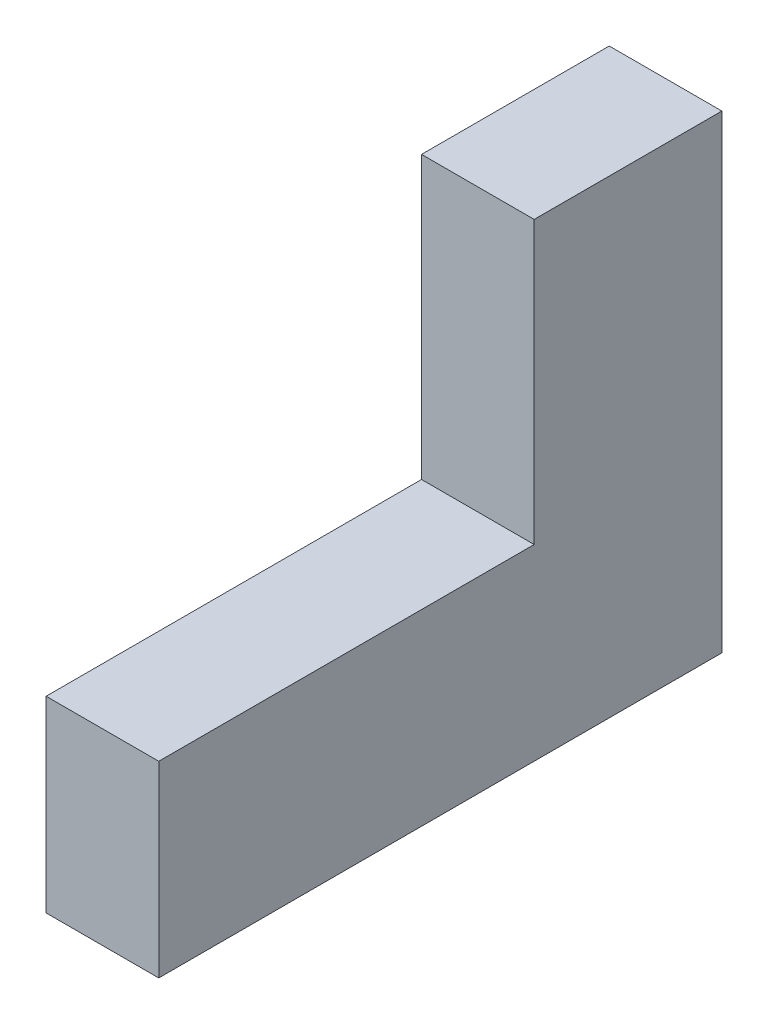
ISO-10303-21;
HEADER;
FILE_DESCRIPTION(('STEP AP214'),'2;1');
FILE_NAME('part.step','',(''),(''),'','','');
FILE_SCHEMA(('AUTOMOTIVE_DESIGN { 1 0 10303 214 1 1 1 1 }'));
ENDSEC;
DATA;
#1=APPLICATION_CONTEXT('core data for automotive mechanical design processes');
#2=APPLICATION_PROTOCOL_DEFINITION('international standard','automotive_design',2000,#1);
#3=PRODUCT_CONTEXT('',#1,'mechanical');
#4=PRODUCT('Part','Part','',(#3));
#5=PRODUCT_RELATED_PRODUCT_CATEGORY('part','',(#4));
#6=PRODUCT_DEFINITION_FORMATION('','',#4);
#7=PRODUCT_DEFINITION_CONTEXT('part definition',#1,'design');
#8=PRODUCT_DEFINITION('design','',#6,#7);
#9=PRODUCT_DEFINITION_SHAPE('','',#8);
#10=(LENGTH_UNIT() NAMED_UNIT(*) SI_UNIT(.MILLI.,.METRE.));
#11=(NAMED_UNIT(*) PLANE_ANGLE_UNIT() SI_UNIT($,.RADIAN.));
#12=(NAMED_UNIT(*) SI_UNIT($,.STERADIAN.) SOLID_ANGLE_UNIT());
#13=UNCERTAINTY_MEASURE_WITH_UNIT(LENGTH_MEASURE(1.E-05),#10,'distance_accuracy_value','');
#14=(GEOMETRIC_REPRESENTATION_CONTEXT(3) GLOBAL_UNCERTAINTY_ASSIGNED_CONTEXT((#13)) GLOBAL_UNIT_ASSIGNED_CONTEXT((#10,
#11,#12)) REPRESENTATION_CONTEXT('',''));
#15=CARTESIAN_POINT('',(0.,0.,0.));
#16=DIRECTION('',(0.,0.,1.));
#17=DIRECTION('',(1.,0.,0.));
#18=AXIS2_PLACEMENT_3D('',#15,#16,#17);
#19=CARTESIAN_POINT('',(2.625,0.,1.5));
#20=DIRECTION('',(1.,0.,0.));
#21=DIRECTION('',(0.,1.,0.));
#22=AXIS2_PLACEMENT_3D('',#19,#20,#21);
#23=PLANE('',#22);
#24=DIRECTION('',(0.,-1.,0.));
#25=VECTOR('',#24,1.);
#26=CARTESIAN_POINT('',(2.625,0.5,1.5));
#27=LINE('',#26,#25);
#28=CARTESIAN_POINT('',(2.625,0.5,1.5));
#29=VERTEX_POINT('',#28);
#30=CARTESIAN_POINT('',(2.625,0.,1.5));
#31=VERTEX_POINT('',#30);
#32=EDGE_CURVE('E157',#29,#31,#27,.T.);
#33=ORIENTED_EDGE('',*,*,#32,.F.);
#34=DIRECTION('',(0.,0.,1.));
#35=VECTOR('',#34,1.);
#36=CARTESIAN_POINT('',(2.625,0.5,0.5));
#37=LINE('',#36,#35);
#38=CARTESIAN_POINT('',(2.625,0.5,0.5));
#39=VERTEX_POINT('',#38);
#40=EDGE_CURVE('E27',#39,#29,#37,.T.);
#41=ORIENTED_EDGE('',*,*,#40,.F.);
#42=DIRECTION('',(0.,-1.,0.));
#43=VECTOR('',#42,1.);
#44=CARTESIAN_POINT('',(2.625,1.25,0.5));
#45=LINE('',#44,#43);
#46=CARTESIAN_POINT('',(2.625,1.25,0.5));
#47=VERTEX_POINT('',#46);
#48=EDGE_CURVE('E80',#47,#39,#45,.T.);
#49=ORIENTED_EDGE('',*,*,#48,.F.);
#50=DIRECTION('',(0.,0.,1.));
#51=VECTOR('',#50,1.);
#52=CARTESIAN_POINT('',(2.625,1.25,0.));
#53=LINE('',#52,#51);
#54=CARTESIAN_POINT('',(2.625,1.25,0.));
#55=VERTEX_POINT('',#54);
#56=EDGE_CURVE('E99',#55,#47,#53,.T.);
#57=ORIENTED_EDGE('',*,*,#56,.F.);
#58=DIRECTION('',(0.,1.,0.));
#59=VECTOR('',#58,1.);
#60=CARTESIAN_POINT('',(2.625,0.,0.));
#61=LINE('',#60,#59);
#62=CARTESIAN_POINT('',(2.625,0.,0.));
#63=VERTEX_POINT('',#62);
#64=EDGE_CURVE('E101',#63,#55,#61,.T.);
#65=ORIENTED_EDGE('',*,*,#64,.F.);
#66=DIRECTION('',(0.,0.,-1.));
#67=VECTOR('',#66,1.);
#68=CARTESIAN_POINT('',(2.625,0.,1.5));
#69=LINE('',#68,#67);
#70=EDGE_CURVE('E54',#31,#63,#69,.T.);
#71=ORIENTED_EDGE('',*,*,#70,.F.);
#72=EDGE_LOOP('',(#33,#41,#49,#57,#65,#71));
#73=FACE_BOUND('',#72,.T.);
#74=ADVANCED_FACE('F17',(#73),#23,.F.);
#75=CARTESIAN_POINT('',(2.925,0.,1.5));
#76=DIRECTION('',(1.,0.,0.));
#77=DIRECTION('',(0.,1.,0.));
#78=AXIS2_PLACEMENT_3D('',#75,#76,#77);
#79=PLANE('',#78);
#80=DIRECTION('',(0.,-1.,0.));
#81=VECTOR('',#80,1.);
#82=CARTESIAN_POINT('',(2.925,0.5,1.5));
#83=LINE('',#82,#81);
#84=CARTESIAN_POINT('',(2.925,0.5,1.5));
#85=VERTEX_POINT('',#84);
#86=CARTESIAN_POINT('',(2.925,0.,1.5));
#87=VERTEX_POINT('',#86);
#88=EDGE_CURVE('E136',#85,#87,#83,.T.);
#89=ORIENTED_EDGE('',*,*,#88,.T.);
#90=DIRECTION('',(0.,0.,-1.));
#91=VECTOR('',#90,1.);
#92=CARTESIAN_POINT('',(2.925,0.,1.5));
#93=LINE('',#92,#91);
#94=CARTESIAN_POINT('',(2.925,0.,0.));
#95=VERTEX_POINT('',#94);
#96=EDGE_CURVE('E117',#87,#95,#93,.T.);
#97=ORIENTED_EDGE('',*,*,#96,.T.);
#98=DIRECTION('',(0.,1.,0.));
#99=VECTOR('',#98,1.);
#100=CARTESIAN_POINT('',(2.925,0.,0.));
#101=LINE('',#100,#99);
#102=CARTESIAN_POINT('',(2.925,1.25,0.));
#103=VERTEX_POINT('',#102);
#104=EDGE_CURVE('E105',#95,#103,#101,.T.);
#105=ORIENTED_EDGE('',*,*,#104,.T.);
#106=DIRECTION('',(0.,0.,1.));
#107=VECTOR('',#106,1.);
#108=CARTESIAN_POINT('',(2.925,1.25,0.));
#109=LINE('',#108,#107);
#110=CARTESIAN_POINT('',(2.925,1.25,0.5));
#111=VERTEX_POINT('',#110);
#112=EDGE_CURVE('E92',#103,#111,#109,.T.);
#113=ORIENTED_EDGE('',*,*,#112,.T.);
#114=DIRECTION('',(0.,-1.,0.));
#115=VECTOR('',#114,1.);
#116=CARTESIAN_POINT('',(2.925,1.25,0.5));
#117=LINE('',#116,#115);
#118=CARTESIAN_POINT('',(2.925,0.5,0.5));
#119=VERTEX_POINT('',#118);
#120=EDGE_CURVE('E145',#111,#119,#117,.T.);
#121=ORIENTED_EDGE('',*,*,#120,.T.);
#122=DIRECTION('',(0.,0.,1.));
#123=VECTOR('',#122,1.);
#124=CARTESIAN_POINT('',(2.925,0.5,0.5));
#125=LINE('',#124,#123);
#126=EDGE_CURVE('E11',#119,#85,#125,.T.);
#127=ORIENTED_EDGE('',*,*,#126,.T.);
#128=EDGE_LOOP('',(#89,#97,#105,#113,#121,#127));
#129=FACE_BOUND('',#128,.T.);
#130=ADVANCED_FACE('F172',(#129),#79,.T.);
#131=CARTESIAN_POINT('',(2.925,0.5,0.5));
#132=DIRECTION('',(0.,-1.,0.));
#133=DIRECTION('',(-1.,0.,0.));
#134=AXIS2_PLACEMENT_3D('',#131,#132,#133);
#135=PLANE('',#134);
#136=ORIENTED_EDGE('',*,*,#40,.T.);
#137=DIRECTION('',(-1.,0.,0.));
#138=VECTOR('',#137,1.);
#139=CARTESIAN_POINT('',(2.925,0.5,1.5));
#140=LINE('',#139,#138);
#141=EDGE_CURVE('E132',#85,#29,#140,.T.);
#142=ORIENTED_EDGE('',*,*,#141,.F.);
#143=ORIENTED_EDGE('',*,*,#126,.F.);
#144=DIRECTION('',(-1.,0.,0.));
#145=VECTOR('',#144,1.);
#146=CARTESIAN_POINT('',(2.925,0.5,0.5));
#147=LINE('',#146,#145);
#148=EDGE_CURVE('E144',#119,#39,#147,.T.);
#149=ORIENTED_EDGE('',*,*,#148,.T.);
#150=EDGE_LOOP('',(#136,#142,#143,#149));
#151=FACE_BOUND('',#150,.T.);
#152=ADVANCED_FACE('F19',(#151),#135,.F.);
#153=CARTESIAN_POINT('',(2.925,1.25,0.5));
#154=DIRECTION('',(0.,0.,-1.));
#155=DIRECTION('',(-1.,0.,0.));
#156=AXIS2_PLACEMENT_3D('',#153,#154,#155);
#157=PLANE('',#156);
#158=ORIENTED_EDGE('',*,*,#48,.T.);
#159=ORIENTED_EDGE('',*,*,#148,.F.);
#160=ORIENTED_EDGE('',*,*,#120,.F.);
#161=DIRECTION('',(-1.,0.,0.));
#162=VECTOR('',#161,1.);
#163=CARTESIAN_POINT('',(2.925,1.25,0.5));
#164=LINE('',#163,#162);
#165=EDGE_CURVE('E104',#111,#47,#164,.T.);
#166=ORIENTED_EDGE('',*,*,#165,.T.);
#167=EDGE_LOOP('',(#158,#159,#160,#166));
#168=FACE_BOUND('',#167,.T.);
#169=ADVANCED_FACE('F174',(#168),#157,.F.);
#170=CARTESIAN_POINT('',(2.925,1.25,0.));
#171=DIRECTION('',(0.,-1.,0.));
#172=DIRECTION('',(-1.,0.,0.));
#173=AXIS2_PLACEMENT_3D('',#170,#171,#172);
#174=PLANE('',#173);
#175=ORIENTED_EDGE('',*,*,#56,.T.);
#176=ORIENTED_EDGE('',*,*,#165,.F.);
#177=ORIENTED_EDGE('',*,*,#112,.F.);
#178=DIRECTION('',(-1.,0.,0.));
#179=VECTOR('',#178,1.);
#180=CARTESIAN_POINT('',(2.925,1.25,0.));
#181=LINE('',#180,#179);
#182=EDGE_CURVE('E108',#103,#55,#181,.T.);
#183=ORIENTED_EDGE('',*,*,#182,.T.);
#184=EDGE_LOOP('',(#175,#176,#177,#183));
#185=FACE_BOUND('',#184,.T.);
#186=ADVANCED_FACE('F109',(#185),#174,.F.);
#187=CARTESIAN_POINT('',(2.925,0.,0.));
#188=DIRECTION('',(0.,0.,1.));
#189=DIRECTION('',(0.,-1.,0.));
#190=AXIS2_PLACEMENT_3D('',#187,#188,#189);
#191=PLANE('',#190);
#192=ORIENTED_EDGE('',*,*,#64,.T.);
#193=ORIENTED_EDGE('',*,*,#182,.F.);
#194=ORIENTED_EDGE('',*,*,#104,.F.);
#195=DIRECTION('',(-1.,0.,0.));
#196=VECTOR('',#195,1.);
#197=CARTESIAN_POINT('',(2.925,0.,0.));
#198=LINE('',#197,#196);
#199=EDGE_CURVE('E115',#95,#63,#198,.T.);
#200=ORIENTED_EDGE('',*,*,#199,.T.);
#201=EDGE_LOOP('',(#192,#193,#194,#200));
#202=FACE_BOUND('',#201,.T.);
#203=ADVANCED_FACE('F113',(#202),#191,.F.);
#204=CARTESIAN_POINT('',(2.925,0.,1.5));
#205=DIRECTION('',(0.,1.,0.));
#206=DIRECTION('',(0.,0.,-1.));
#207=AXIS2_PLACEMENT_3D('',#204,#205,#206);
#208=PLANE('',#207);
#209=ORIENTED_EDGE('',*,*,#70,.T.);
#210=ORIENTED_EDGE('',*,*,#199,.F.);
#211=ORIENTED_EDGE('',*,*,#96,.F.);
#212=DIRECTION('',(-1.,0.,0.));
#213=VECTOR('',#212,1.);
#214=CARTESIAN_POINT('',(2.925,0.,1.5));
#215=LINE('',#214,#213);
#216=EDGE_CURVE('E140',#87,#31,#215,.T.);
#217=ORIENTED_EDGE('',*,*,#216,.T.);
#218=EDGE_LOOP('',(#209,#210,#211,#217));
#219=FACE_BOUND('',#218,.T.);
#220=ADVANCED_FACE('F163',(#219),#208,.F.);
#221=CARTESIAN_POINT('',(2.925,0.5,1.5));
#222=DIRECTION('',(0.,0.,-1.));
#223=DIRECTION('',(0.,-1.,0.));
#224=AXIS2_PLACEMENT_3D('',#221,#222,#223);
#225=PLANE('',#224);
#226=ORIENTED_EDGE('',*,*,#32,.T.);
#227=ORIENTED_EDGE('',*,*,#216,.F.);
#228=ORIENTED_EDGE('',*,*,#88,.F.);
#229=ORIENTED_EDGE('',*,*,#141,.T.);
#230=EDGE_LOOP('',(#226,#227,#228,#229));
#231=FACE_BOUND('',#230,.T.);
#232=ADVANCED_FACE('F166',(#231),#225,.F.);
#233=CLOSED_SHELL('',(#74,#130,#152,#169,#186,#203,#220,#232));
#234=MANIFOLD_SOLID_BREP('B1',#233);
#235=ADVANCED_BREP_SHAPE_REPRESENTATION('',(#18,#234),#14);
#236=SHAPE_DEFINITION_REPRESENTATION(#9,#235);
ENDSEC;
END-ISO-10303-21;
